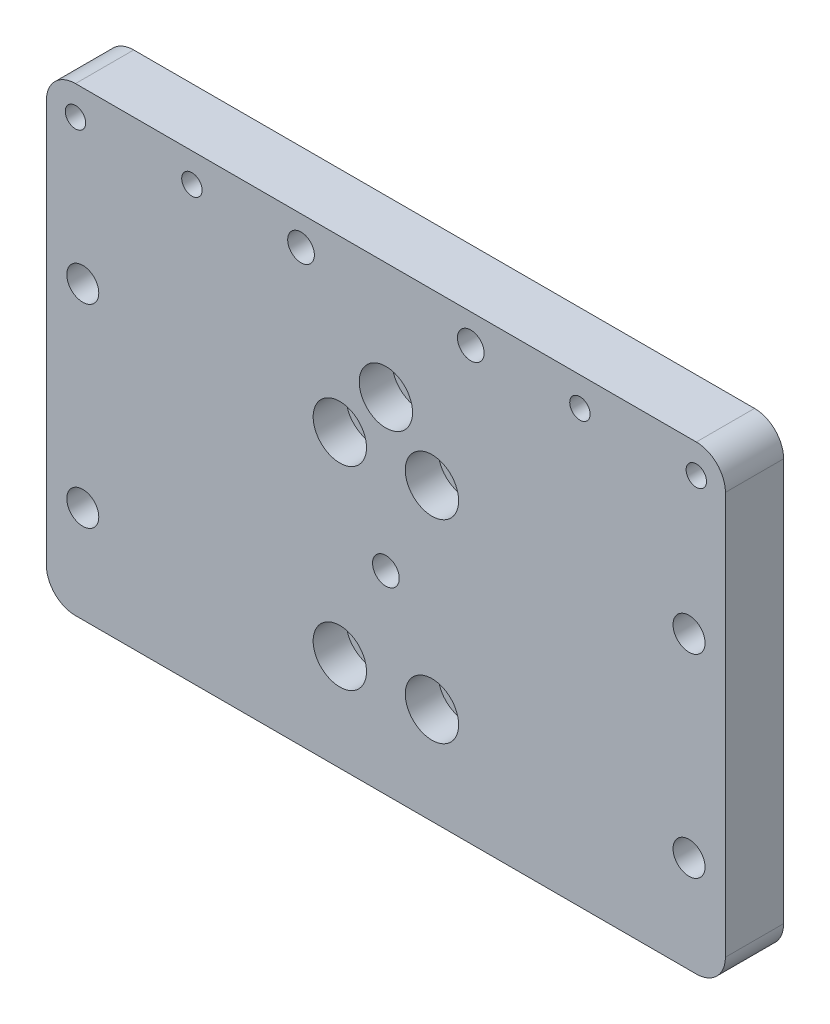
ISO-10303-21;
HEADER;
FILE_DESCRIPTION(('STEP AP214'),'2;1');
FILE_NAME('part.step','',(''),(''),'','','');
FILE_SCHEMA(('AUTOMOTIVE_DESIGN { 1 0 10303 214 1 1 1 1 }'));
ENDSEC;
DATA;
#1=APPLICATION_CONTEXT('core data for automotive mechanical design processes');
#2=APPLICATION_PROTOCOL_DEFINITION('international standard','automotive_design',2000,#1);
#3=PRODUCT_CONTEXT('',#1,'mechanical');
#4=PRODUCT('Part','Part','',(#3));
#5=PRODUCT_RELATED_PRODUCT_CATEGORY('part','',(#4));
#6=PRODUCT_DEFINITION_FORMATION('','',#4);
#7=PRODUCT_DEFINITION_CONTEXT('part definition',#1,'design');
#8=PRODUCT_DEFINITION('design','',#6,#7);
#9=PRODUCT_DEFINITION_SHAPE('','',#8);
#10=(LENGTH_UNIT() NAMED_UNIT(*) SI_UNIT(.MILLI.,.METRE.));
#11=(NAMED_UNIT(*) PLANE_ANGLE_UNIT() SI_UNIT($,.RADIAN.));
#12=(NAMED_UNIT(*) SI_UNIT($,.STERADIAN.) SOLID_ANGLE_UNIT());
#13=UNCERTAINTY_MEASURE_WITH_UNIT(LENGTH_MEASURE(1.E-05),#10,'distance_accuracy_value','');
#14=(GEOMETRIC_REPRESENTATION_CONTEXT(3) GLOBAL_UNCERTAINTY_ASSIGNED_CONTEXT((#13)) GLOBAL_UNIT_ASSIGNED_CONTEXT((#10,
#11,#12)) REPRESENTATION_CONTEXT('',''));
#15=CARTESIAN_POINT('',(0.,0.,0.));
#16=DIRECTION('',(0.,0.,1.));
#17=DIRECTION('',(1.,0.,0.));
#18=AXIS2_PLACEMENT_3D('',#15,#16,#17);
#19=CARTESIAN_POINT('',(0.,23.5,-6.));
#20=DIRECTION('',(0.,0.,1.));
#21=DIRECTION('',(1.,0.,0.));
#22=AXIS2_PLACEMENT_3D('',#19,#20,#21);
#23=CYLINDRICAL_SURFACE('',#22,2.75);
#24=CARTESIAN_POINT('',(0.,23.5,-6.));
#25=DIRECTION('',(0.,0.,1.));
#26=DIRECTION('',(1.,0.,0.));
#27=AXIS2_PLACEMENT_3D('',#24,#25,#26);
#28=CIRCLE('',#27,2.75);
#29=CARTESIAN_POINT('',(2.75000000000001,23.5,-6.));
#30=VERTEX_POINT('',#29);
#31=EDGE_CURVE('E181',#30,#30,#28,.T.);
#32=ORIENTED_EDGE('',*,*,#31,.F.);
#33=EDGE_LOOP('',(#32));
#34=FACE_BOUND('',#33,.T.);
#35=CARTESIAN_POINT('',(0.,23.5,-0.799999999999999));
#36=DIRECTION('',(0.,0.,1.));
#37=DIRECTION('',(1.,0.,0.));
#38=AXIS2_PLACEMENT_3D('',#35,#36,#37);
#39=CIRCLE('',#38,2.75);
#40=CARTESIAN_POINT('',(2.75000000000001,23.5,-0.799999999999999));
#41=VERTEX_POINT('',#40);
#42=EDGE_CURVE('E147',#41,#41,#39,.F.);
#43=ORIENTED_EDGE('',*,*,#42,.F.);
#44=EDGE_LOOP('',(#43));
#45=FACE_BOUND('',#44,.T.);
#46=ADVANCED_FACE('F32',(#34,#45),#23,.F.);
#47=CARTESIAN_POINT('',(-9.49999999999999,12.5,-6.));
#48=DIRECTION('',(0.,0.,1.));
#49=DIRECTION('',(1.,0.,0.));
#50=AXIS2_PLACEMENT_3D('',#47,#48,#49);
#51=CYLINDRICAL_SURFACE('',#50,3.3);
#52=CARTESIAN_POINT('',(-9.49999999999999,12.5,-6.));
#53=DIRECTION('',(0.,0.,1.));
#54=DIRECTION('',(1.,0.,0.));
#55=AXIS2_PLACEMENT_3D('',#52,#53,#54);
#56=CIRCLE('',#55,3.3);
#57=CARTESIAN_POINT('',(-6.19999999999999,12.5,-6.));
#58=VERTEX_POINT('',#57);
#59=EDGE_CURVE('E220',#58,#58,#56,.T.);
#60=ORIENTED_EDGE('',*,*,#59,.F.);
#61=EDGE_LOOP('',(#60));
#62=FACE_BOUND('',#61,.T.);
#63=CARTESIAN_POINT('',(-9.49999999999999,12.5,-0.799999999999999));
#64=DIRECTION('',(0.,0.,1.));
#65=DIRECTION('',(1.,0.,0.));
#66=AXIS2_PLACEMENT_3D('',#63,#64,#65);
#67=CIRCLE('',#66,3.3);
#68=CARTESIAN_POINT('',(-6.19999999999999,12.5,-0.799999999999999));
#69=VERTEX_POINT('',#68);
#70=EDGE_CURVE('E144',#69,#69,#67,.F.);
#71=ORIENTED_EDGE('',*,*,#70,.F.);
#72=EDGE_LOOP('',(#71));
#73=FACE_BOUND('',#72,.T.);
#74=ADVANCED_FACE('F352',(#62,#73),#51,.F.);
#75=CARTESIAN_POINT('',(9.50000000000001,12.5,-6.));
#76=DIRECTION('',(0.,0.,1.));
#77=DIRECTION('',(1.,0.,0.));
#78=AXIS2_PLACEMENT_3D('',#75,#76,#77);
#79=CYLINDRICAL_SURFACE('',#78,3.3);
#80=CARTESIAN_POINT('',(9.50000000000001,12.5,-6.));
#81=DIRECTION('',(0.,0.,1.));
#82=DIRECTION('',(-1.,0.,0.));
#83=AXIS2_PLACEMENT_3D('',#80,#81,#82);
#84=CIRCLE('',#83,3.3);
#85=CARTESIAN_POINT('',(6.20000000000001,12.5,-6.));
#86=VERTEX_POINT('',#85);
#87=EDGE_CURVE('E135',#86,#86,#84,.T.);
#88=ORIENTED_EDGE('',*,*,#87,.F.);
#89=EDGE_LOOP('',(#88));
#90=FACE_BOUND('',#89,.T.);
#91=CARTESIAN_POINT('',(9.50000000000001,12.5,-0.799999999999999));
#92=DIRECTION('',(0.,0.,1.));
#93=DIRECTION('',(1.,0.,0.));
#94=AXIS2_PLACEMENT_3D('',#91,#92,#93);
#95=CIRCLE('',#94,3.3);
#96=CARTESIAN_POINT('',(12.8,12.5,-0.799999999999999));
#97=VERTEX_POINT('',#96);
#98=EDGE_CURVE('E140',#97,#97,#95,.F.);
#99=ORIENTED_EDGE('',*,*,#98,.F.);
#100=EDGE_LOOP('',(#99));
#101=FACE_BOUND('',#100,.T.);
#102=ADVANCED_FACE('F358',(#90,#101),#79,.F.);
#103=CARTESIAN_POINT('',(9.50000000000001,-27.5,-6.));
#104=DIRECTION('',(0.,0.,1.));
#105=DIRECTION('',(1.,0.,0.));
#106=AXIS2_PLACEMENT_3D('',#103,#104,#105);
#107=CYLINDRICAL_SURFACE('',#106,3.3);
#108=CARTESIAN_POINT('',(9.50000000000001,-27.5,-6.));
#109=DIRECTION('',(0.,0.,1.));
#110=DIRECTION('',(-1.,0.,0.));
#111=AXIS2_PLACEMENT_3D('',#108,#109,#110);
#112=CIRCLE('',#111,3.3);
#113=CARTESIAN_POINT('',(6.20000000000001,-27.5,-6.));
#114=VERTEX_POINT('',#113);
#115=EDGE_CURVE('E254',#114,#114,#112,.T.);
#116=ORIENTED_EDGE('',*,*,#115,.F.);
#117=EDGE_LOOP('',(#116));
#118=FACE_BOUND('',#117,.T.);
#119=CARTESIAN_POINT('',(9.50000000000001,-27.5,-0.799999999999999));
#120=DIRECTION('',(0.,0.,1.));
#121=DIRECTION('',(1.,0.,0.));
#122=AXIS2_PLACEMENT_3D('',#119,#120,#121);
#123=CIRCLE('',#122,3.3);
#124=CARTESIAN_POINT('',(12.8,-27.5,-0.799999999999999));
#125=VERTEX_POINT('',#124);
#126=EDGE_CURVE('E137',#125,#125,#123,.F.);
#127=ORIENTED_EDGE('',*,*,#126,.F.);
#128=EDGE_LOOP('',(#127));
#129=FACE_BOUND('',#128,.T.);
#130=ADVANCED_FACE('F510',(#118,#129),#107,.F.);
#131=CARTESIAN_POINT('',(-9.49999999999999,-27.5,-6.));
#132=DIRECTION('',(0.,0.,1.));
#133=DIRECTION('',(1.,0.,0.));
#134=AXIS2_PLACEMENT_3D('',#131,#132,#133);
#135=CYLINDRICAL_SURFACE('',#134,3.3);
#136=CARTESIAN_POINT('',(-9.49999999999999,-27.5,-6.));
#137=DIRECTION('',(0.,0.,1.));
#138=DIRECTION('',(1.,0.,0.));
#139=AXIS2_PLACEMENT_3D('',#136,#137,#138);
#140=CIRCLE('',#139,3.3);
#141=CARTESIAN_POINT('',(-6.19999999999999,-27.5,-6.));
#142=VERTEX_POINT('',#141);
#143=EDGE_CURVE('E217',#142,#142,#140,.T.);
#144=ORIENTED_EDGE('',*,*,#143,.F.);
#145=EDGE_LOOP('',(#144));
#146=FACE_BOUND('',#145,.T.);
#147=CARTESIAN_POINT('',(-9.49999999999999,-27.5,-0.799999999999999));
#148=DIRECTION('',(0.,0.,1.));
#149=DIRECTION('',(1.,0.,0.));
#150=AXIS2_PLACEMENT_3D('',#147,#148,#149);
#151=CIRCLE('',#150,3.3);
#152=CARTESIAN_POINT('',(-6.19999999999999,-27.5,-0.799999999999999));
#153=VERTEX_POINT('',#152);
#154=EDGE_CURVE('E132',#153,#153,#151,.F.);
#155=ORIENTED_EDGE('',*,*,#154,.F.);
#156=EDGE_LOOP('',(#155));
#157=FACE_BOUND('',#156,.T.);
#158=ADVANCED_FACE('F379',(#146,#157),#135,.F.);
#159=CARTESIAN_POINT('',(-70.,-47.5,6.));
#160=DIRECTION('',(1.,0.,0.));
#161=DIRECTION('',(0.,0.,-1.));
#162=AXIS2_PLACEMENT_3D('',#159,#160,#161);
#163=PLANE('',#162);
#164=DIRECTION('',(0.,-1.,0.));
#165=VECTOR('',#164,1.);
#166=CARTESIAN_POINT('',(-70.,-47.5,-6.));
#167=LINE('',#166,#165);
#168=CARTESIAN_POINT('',(-70.,41.5,-6.));
#169=VERTEX_POINT('',#168);
#170=CARTESIAN_POINT('',(-70.,-41.5,-6.));
#171=VERTEX_POINT('',#170);
#172=EDGE_CURVE('E128',#169,#171,#167,.T.);
#173=ORIENTED_EDGE('',*,*,#172,.T.);
#174=DIRECTION('',(0.,0.,-1.));
#175=VECTOR('',#174,1.);
#176=CARTESIAN_POINT('',(-70.,-41.5,6.));
#177=LINE('',#176,#175);
#178=CARTESIAN_POINT('',(-70.,-41.5,6.));
#179=VERTEX_POINT('',#178);
#180=EDGE_CURVE('E11',#171,#179,#177,.F.);
#181=ORIENTED_EDGE('',*,*,#180,.T.);
#182=DIRECTION('',(0.,-1.,0.));
#183=VECTOR('',#182,1.);
#184=CARTESIAN_POINT('',(-70.,-47.5,6.));
#185=LINE('',#184,#183);
#186=CARTESIAN_POINT('',(-70.,41.5,6.));
#187=VERTEX_POINT('',#186);
#188=EDGE_CURVE('E126',#187,#179,#185,.T.);
#189=ORIENTED_EDGE('',*,*,#188,.F.);
#190=DIRECTION('',(0.,0.,-1.));
#191=VECTOR('',#190,1.);
#192=CARTESIAN_POINT('',(-70.,41.5,6.));
#193=LINE('',#192,#191);
#194=EDGE_CURVE('E40',#187,#169,#193,.T.);
#195=ORIENTED_EDGE('',*,*,#194,.T.);
#196=EDGE_LOOP('',(#173,#181,#189,#195));
#197=FACE_BOUND('',#196,.T.);
#198=ADVANCED_FACE('F176',(#197),#163,.F.);
#199=CARTESIAN_POINT('',(70.,-47.5,6.));
#200=DIRECTION('',(0.,1.,0.));
#201=DIRECTION('',(-1.,0.,0.));
#202=AXIS2_PLACEMENT_3D('',#199,#200,#201);
#203=PLANE('',#202);
#204=DIRECTION('',(1.,0.,0.));
#205=VECTOR('',#204,1.);
#206=CARTESIAN_POINT('',(70.,-47.5,-6.));
#207=LINE('',#206,#205);
#208=CARTESIAN_POINT('',(-64.,-47.5,-6.));
#209=VERTEX_POINT('',#208);
#210=CARTESIAN_POINT('',(64.,-47.5,-6.));
#211=VERTEX_POINT('',#210);
#212=EDGE_CURVE('E124',#209,#211,#207,.T.);
#213=ORIENTED_EDGE('',*,*,#212,.T.);
#214=DIRECTION('',(0.,0.,-1.));
#215=VECTOR('',#214,1.);
#216=CARTESIAN_POINT('',(64.,-47.5,6.));
#217=LINE('',#216,#215);
#218=CARTESIAN_POINT('',(64.,-47.5,6.));
#219=VERTEX_POINT('',#218);
#220=EDGE_CURVE('E103',#211,#219,#217,.F.);
#221=ORIENTED_EDGE('',*,*,#220,.T.);
#222=DIRECTION('',(1.,0.,0.));
#223=VECTOR('',#222,1.);
#224=CARTESIAN_POINT('',(70.,-47.5,6.));
#225=LINE('',#224,#223);
#226=CARTESIAN_POINT('',(-64.,-47.5,6.));
#227=VERTEX_POINT('',#226);
#228=EDGE_CURVE('E188',#227,#219,#225,.T.);
#229=ORIENTED_EDGE('',*,*,#228,.F.);
#230=DIRECTION('',(0.,0.,-1.));
#231=VECTOR('',#230,1.);
#232=CARTESIAN_POINT('',(-64.,-47.5,6.));
#233=LINE('',#232,#231);
#234=EDGE_CURVE('E108',#227,#209,#233,.T.);
#235=ORIENTED_EDGE('',*,*,#234,.T.);
#236=EDGE_LOOP('',(#213,#221,#229,#235));
#237=FACE_BOUND('',#236,.T.);
#238=ADVANCED_FACE('F343',(#237),#203,.F.);
#239=CARTESIAN_POINT('',(70.,-47.5,6.));
#240=DIRECTION('',(-1.,0.,0.));
#241=DIRECTION('',(0.,0.,1.));
#242=AXIS2_PLACEMENT_3D('',#239,#240,#241);
#243=PLANE('',#242);
#244=DIRECTION('',(0.,1.,0.));
#245=VECTOR('',#244,1.);
#246=CARTESIAN_POINT('',(70.,-47.5,6.));
#247=LINE('',#246,#245);
#248=CARTESIAN_POINT('',(70.,-41.5,6.));
#249=VERTEX_POINT('',#248);
#250=CARTESIAN_POINT('',(70.,41.5,6.));
#251=VERTEX_POINT('',#250);
#252=EDGE_CURVE('E117',#249,#251,#247,.T.);
#253=ORIENTED_EDGE('',*,*,#252,.F.);
#254=DIRECTION('',(0.,0.,-1.));
#255=VECTOR('',#254,1.);
#256=CARTESIAN_POINT('',(70.,-41.5,6.));
#257=LINE('',#256,#255);
#258=CARTESIAN_POINT('',(70.,-41.5,-6.));
#259=VERTEX_POINT('',#258);
#260=EDGE_CURVE('E102',#249,#259,#257,.T.);
#261=ORIENTED_EDGE('',*,*,#260,.T.);
#262=DIRECTION('',(0.,1.,0.));
#263=VECTOR('',#262,1.);
#264=CARTESIAN_POINT('',(70.,-47.5,-6.));
#265=LINE('',#264,#263);
#266=CARTESIAN_POINT('',(70.,41.5,-6.));
#267=VERTEX_POINT('',#266);
#268=EDGE_CURVE('E115',#259,#267,#265,.T.);
#269=ORIENTED_EDGE('',*,*,#268,.T.);
#270=DIRECTION('',(0.,0.,-1.));
#271=VECTOR('',#270,1.);
#272=CARTESIAN_POINT('',(70.,41.5,6.));
#273=LINE('',#272,#271);
#274=EDGE_CURVE('E119',#267,#251,#273,.F.);
#275=ORIENTED_EDGE('',*,*,#274,.T.);
#276=EDGE_LOOP('',(#253,#261,#269,#275));
#277=FACE_BOUND('',#276,.T.);
#278=ADVANCED_FACE('F114',(#277),#243,.F.);
#279=CARTESIAN_POINT('',(70.,47.5,6.));
#280=DIRECTION('',(0.,-1.,0.));
#281=DIRECTION('',(1.,0.,0.));
#282=AXIS2_PLACEMENT_3D('',#279,#280,#281);
#283=PLANE('',#282);
#284=DIRECTION('',(-1.,0.,0.));
#285=VECTOR('',#284,1.);
#286=CARTESIAN_POINT('',(70.,47.5,6.));
#287=LINE('',#286,#285);
#288=CARTESIAN_POINT('',(64.,47.5,6.));
#289=VERTEX_POINT('',#288);
#290=CARTESIAN_POINT('',(-64.,47.5,6.));
#291=VERTEX_POINT('',#290);
#292=EDGE_CURVE('E151',#289,#291,#287,.T.);
#293=ORIENTED_EDGE('',*,*,#292,.F.);
#294=DIRECTION('',(0.,0.,-1.));
#295=VECTOR('',#294,1.);
#296=CARTESIAN_POINT('',(64.,47.5,6.));
#297=LINE('',#296,#295);
#298=CARTESIAN_POINT('',(64.,47.5,-6.));
#299=VERTEX_POINT('',#298);
#300=EDGE_CURVE('E168',#289,#299,#297,.T.);
#301=ORIENTED_EDGE('',*,*,#300,.T.);
#302=DIRECTION('',(-1.,0.,0.));
#303=VECTOR('',#302,1.);
#304=CARTESIAN_POINT('',(70.,47.5,-6.));
#305=LINE('',#304,#303);
#306=CARTESIAN_POINT('',(-64.,47.5,-6.));
#307=VERTEX_POINT('',#306);
#308=EDGE_CURVE('E123',#299,#307,#305,.T.);
#309=ORIENTED_EDGE('',*,*,#308,.T.);
#310=DIRECTION('',(0.,0.,-1.));
#311=VECTOR('',#310,1.);
#312=CARTESIAN_POINT('',(-64.,47.5,6.));
#313=LINE('',#312,#311);
#314=EDGE_CURVE('E47',#307,#291,#313,.F.);
#315=ORIENTED_EDGE('',*,*,#314,.T.);
#316=EDGE_LOOP('',(#293,#301,#309,#315));
#317=FACE_BOUND('',#316,.T.);
#318=ADVANCED_FACE('F309',(#317),#283,.F.);
#319=CARTESIAN_POINT('',(0.,0.,6.));
#320=DIRECTION('',(0.,0.,1.));
#321=DIRECTION('',(1.,0.,0.));
#322=AXIS2_PLACEMENT_3D('',#319,#320,#321);
#323=PLANE('',#322);
#324=CARTESIAN_POINT('',(0.,23.5,6.));
#325=DIRECTION('',(0.,0.,1.));
#326=DIRECTION('',(1.,0.,0.));
#327=AXIS2_PLACEMENT_3D('',#324,#325,#326);
#328=CIRCLE('',#327,5.5);
#329=CARTESIAN_POINT('',(5.50000000000001,23.5,6.));
#330=VERTEX_POINT('',#329);
#331=EDGE_CURVE('E284',#330,#330,#328,.T.);
#332=ORIENTED_EDGE('',*,*,#331,.F.);
#333=EDGE_LOOP('',(#332));
#334=FACE_BOUND('',#333,.T.);
#335=CARTESIAN_POINT('',(-9.49999999999999,12.5,6.));
#336=DIRECTION('',(0.,0.,1.));
#337=DIRECTION('',(1.,0.,0.));
#338=AXIS2_PLACEMENT_3D('',#335,#336,#337);
#339=CIRCLE('',#338,5.5);
#340=CARTESIAN_POINT('',(-3.99999999999999,12.5,6.));
#341=VERTEX_POINT('',#340);
#342=EDGE_CURVE('E290',#341,#341,#339,.T.);
#343=ORIENTED_EDGE('',*,*,#342,.F.);
#344=EDGE_LOOP('',(#343));
#345=FACE_BOUND('',#344,.T.);
#346=CARTESIAN_POINT('',(9.50000000000001,12.5,6.));
#347=DIRECTION('',(0.,0.,1.));
#348=DIRECTION('',(1.,0.,0.));
#349=AXIS2_PLACEMENT_3D('',#346,#347,#348);
#350=CIRCLE('',#349,5.5);
#351=CARTESIAN_POINT('',(15.,12.5,6.));
#352=VERTEX_POINT('',#351);
#353=EDGE_CURVE('E272',#352,#352,#350,.T.);
#354=ORIENTED_EDGE('',*,*,#353,.F.);
#355=EDGE_LOOP('',(#354));
#356=FACE_BOUND('',#355,.T.);
#357=CARTESIAN_POINT('',(9.50000000000001,-27.5,6.));
#358=DIRECTION('',(0.,0.,1.));
#359=DIRECTION('',(1.,0.,0.));
#360=AXIS2_PLACEMENT_3D('',#357,#358,#359);
#361=CIRCLE('',#360,5.5);
#362=CARTESIAN_POINT('',(15.,-27.5,6.));
#363=VERTEX_POINT('',#362);
#364=EDGE_CURVE('E279',#363,#363,#361,.T.);
#365=ORIENTED_EDGE('',*,*,#364,.F.);
#366=EDGE_LOOP('',(#365));
#367=FACE_BOUND('',#366,.T.);
#368=CARTESIAN_POINT('',(-9.49999999999999,-27.5,6.));
#369=DIRECTION('',(0.,0.,1.));
#370=DIRECTION('',(1.,0.,0.));
#371=AXIS2_PLACEMENT_3D('',#368,#369,#370);
#372=CIRCLE('',#371,5.5);
#373=CARTESIAN_POINT('',(-3.99999999999999,-27.5,6.));
#374=VERTEX_POINT('',#373);
#375=EDGE_CURVE('E150',#374,#374,#372,.T.);
#376=ORIENTED_EDGE('',*,*,#375,.F.);
#377=EDGE_LOOP('',(#376));
#378=FACE_BOUND('',#377,.T.);
#379=CARTESIAN_POINT('',(-62.5,-27.5,6.));
#380=DIRECTION('',(0.,0.,1.));
#381=DIRECTION('',(1.,0.,0.));
#382=AXIS2_PLACEMENT_3D('',#379,#380,#381);
#383=CIRCLE('',#382,3.3);
#384=CARTESIAN_POINT('',(-59.2,-27.5,6.));
#385=VERTEX_POINT('',#384);
#386=EDGE_CURVE('E247',#385,#385,#383,.T.);
#387=ORIENTED_EDGE('',*,*,#386,.F.);
#388=EDGE_LOOP('',(#387));
#389=FACE_BOUND('',#388,.T.);
#390=CARTESIAN_POINT('',(62.5000000000001,-27.5,6.));
#391=DIRECTION('',(0.,0.,1.));
#392=DIRECTION('',(-1.,0.,0.));
#393=AXIS2_PLACEMENT_3D('',#390,#391,#392);
#394=CIRCLE('',#393,3.3);
#395=CARTESIAN_POINT('',(59.2000000000001,-27.5,6.));
#396=VERTEX_POINT('',#395);
#397=EDGE_CURVE('E241',#396,#396,#394,.T.);
#398=ORIENTED_EDGE('',*,*,#397,.F.);
#399=EDGE_LOOP('',(#398));
#400=FACE_BOUND('',#399,.T.);
#401=CARTESIAN_POINT('',(62.5,12.5,6.));
#402=DIRECTION('',(0.,0.,1.));
#403=DIRECTION('',(-1.,0.,0.));
#404=AXIS2_PLACEMENT_3D('',#401,#402,#403);
#405=CIRCLE('',#404,3.3);
#406=CARTESIAN_POINT('',(59.2,12.5,6.));
#407=VERTEX_POINT('',#406);
#408=EDGE_CURVE('E235',#407,#407,#405,.T.);
#409=ORIENTED_EDGE('',*,*,#408,.F.);
#410=EDGE_LOOP('',(#409));
#411=FACE_BOUND('',#410,.T.);
#412=CARTESIAN_POINT('',(64.,41.5,6.));
#413=DIRECTION('',(0.,0.,1.));
#414=DIRECTION('',(-1.,0.,0.));
#415=AXIS2_PLACEMENT_3D('',#412,#413,#414);
#416=CIRCLE('',#415,2.1);
#417=CARTESIAN_POINT('',(61.9,41.5,6.));
#418=VERTEX_POINT('',#417);
#419=EDGE_CURVE('E228',#418,#418,#416,.T.);
#420=ORIENTED_EDGE('',*,*,#419,.F.);
#421=EDGE_LOOP('',(#420));
#422=FACE_BOUND('',#421,.T.);
#423=CARTESIAN_POINT('',(40.,41.5,6.));
#424=DIRECTION('',(0.,0.,1.));
#425=DIRECTION('',(-1.,0.,0.));
#426=AXIS2_PLACEMENT_3D('',#423,#424,#425);
#427=CIRCLE('',#426,2.1);
#428=CARTESIAN_POINT('',(37.9,41.5,6.));
#429=VERTEX_POINT('',#428);
#430=EDGE_CURVE('E263',#429,#429,#427,.T.);
#431=ORIENTED_EDGE('',*,*,#430,.F.);
#432=EDGE_LOOP('',(#431));
#433=FACE_BOUND('',#432,.T.);
#434=CARTESIAN_POINT('',(17.5,41.5,6.));
#435=DIRECTION('',(0.,0.,1.));
#436=DIRECTION('',(-1.,0.,0.));
#437=AXIS2_PLACEMENT_3D('',#434,#435,#436);
#438=CIRCLE('',#437,2.75);
#439=CARTESIAN_POINT('',(14.75,41.5,6.));
#440=VERTEX_POINT('',#439);
#441=EDGE_CURVE('E257',#440,#440,#438,.T.);
#442=ORIENTED_EDGE('',*,*,#441,.F.);
#443=EDGE_LOOP('',(#442));
#444=FACE_BOUND('',#443,.T.);
#445=CARTESIAN_POINT('',(-62.5,12.5,6.));
#446=DIRECTION('',(0.,0.,1.));
#447=DIRECTION('',(1.,0.,0.));
#448=AXIS2_PLACEMENT_3D('',#445,#446,#447);
#449=CIRCLE('',#448,3.3);
#450=CARTESIAN_POINT('',(-59.2,12.5,6.));
#451=VERTEX_POINT('',#450);
#452=EDGE_CURVE('E192',#451,#451,#449,.T.);
#453=ORIENTED_EDGE('',*,*,#452,.F.);
#454=EDGE_LOOP('',(#453));
#455=FACE_BOUND('',#454,.T.);
#456=CARTESIAN_POINT('',(-64.,41.5,6.));
#457=DIRECTION('',(0.,0.,1.));
#458=DIRECTION('',(1.,0.,0.));
#459=AXIS2_PLACEMENT_3D('',#456,#457,#458);
#460=CIRCLE('',#459,2.1);
#461=CARTESIAN_POINT('',(-61.9,41.5,6.));
#462=VERTEX_POINT('',#461);
#463=EDGE_CURVE('E199',#462,#462,#460,.T.);
#464=ORIENTED_EDGE('',*,*,#463,.F.);
#465=EDGE_LOOP('',(#464));
#466=FACE_BOUND('',#465,.T.);
#467=CARTESIAN_POINT('',(-40.,41.5,6.));
#468=DIRECTION('',(0.,0.,1.));
#469=DIRECTION('',(1.,0.,0.));
#470=AXIS2_PLACEMENT_3D('',#467,#468,#469);
#471=CIRCLE('',#470,2.1);
#472=CARTESIAN_POINT('',(-37.9,41.5,6.));
#473=VERTEX_POINT('',#472);
#474=EDGE_CURVE('E205',#473,#473,#471,.T.);
#475=ORIENTED_EDGE('',*,*,#474,.F.);
#476=EDGE_LOOP('',(#475));
#477=FACE_BOUND('',#476,.T.);
#478=CARTESIAN_POINT('',(-17.5,41.5,6.));
#479=DIRECTION('',(0.,0.,1.));
#480=DIRECTION('',(1.,0.,0.));
#481=AXIS2_PLACEMENT_3D('',#478,#479,#480);
#482=CIRCLE('',#481,2.75);
#483=CARTESIAN_POINT('',(-14.75,41.5,6.));
#484=VERTEX_POINT('',#483);
#485=EDGE_CURVE('E211',#484,#484,#482,.T.);
#486=ORIENTED_EDGE('',*,*,#485,.F.);
#487=EDGE_LOOP('',(#486));
#488=FACE_BOUND('',#487,.T.);
#489=CARTESIAN_POINT('',(0.,-7.49999999999999,6.));
#490=DIRECTION('',(0.,0.,1.));
#491=DIRECTION('',(1.,0.,0.));
#492=AXIS2_PLACEMENT_3D('',#489,#490,#491);
#493=CIRCLE('',#492,2.75);
#494=CARTESIAN_POINT('',(2.75000000000001,-7.49999999999999,6.));
#495=VERTEX_POINT('',#494);
#496=EDGE_CURVE('E223',#495,#495,#493,.T.);
#497=ORIENTED_EDGE('',*,*,#496,.F.);
#498=EDGE_LOOP('',(#497));
#499=FACE_BOUND('',#498,.T.);
#500=ORIENTED_EDGE('',*,*,#228,.T.);
#501=CARTESIAN_POINT('',(64.,-41.5,6.));
#502=DIRECTION('',(0.,0.,1.));
#503=DIRECTION('',(1.,0.,0.));
#504=AXIS2_PLACEMENT_3D('',#501,#502,#503);
#505=CIRCLE('',#504,6.);
#506=EDGE_CURVE('E165',#219,#249,#505,.T.);
#507=ORIENTED_EDGE('',*,*,#506,.T.);
#508=ORIENTED_EDGE('',*,*,#252,.T.);
#509=CARTESIAN_POINT('',(64.,41.5,6.));
#510=DIRECTION('',(0.,0.,1.));
#511=DIRECTION('',(1.,0.,0.));
#512=AXIS2_PLACEMENT_3D('',#509,#510,#511);
#513=CIRCLE('',#512,6.);
#514=EDGE_CURVE('E54',#251,#289,#513,.T.);
#515=ORIENTED_EDGE('',*,*,#514,.T.);
#516=ORIENTED_EDGE('',*,*,#292,.T.);
#517=CARTESIAN_POINT('',(-64.,41.5,6.));
#518=DIRECTION('',(0.,0.,1.));
#519=DIRECTION('',(1.,0.,0.));
#520=AXIS2_PLACEMENT_3D('',#517,#518,#519);
#521=CIRCLE('',#520,6.);
#522=EDGE_CURVE('E160',#291,#187,#521,.T.);
#523=ORIENTED_EDGE('',*,*,#522,.T.);
#524=ORIENTED_EDGE('',*,*,#188,.T.);
#525=CARTESIAN_POINT('',(-64.,-41.5,6.));
#526=DIRECTION('',(0.,0.,1.));
#527=DIRECTION('',(1.,0.,0.));
#528=AXIS2_PLACEMENT_3D('',#525,#526,#527);
#529=CIRCLE('',#528,6.);
#530=EDGE_CURVE('E162',#179,#227,#529,.T.);
#531=ORIENTED_EDGE('',*,*,#530,.T.);
#532=EDGE_LOOP('',(#500,#507,#508,#515,#516,#523,#524,#531));
#533=FACE_BOUND('',#532,.T.);
#534=ADVANCED_FACE('F306',(#334,#345,#356,#367,#378,#389,#400,#411,#422,#433,#444,#455,#466,
#477,#488,#499,#533),#323,.T.);
#535=CARTESIAN_POINT('',(0.,0.,-6.));
#536=DIRECTION('',(0.,0.,1.));
#537=DIRECTION('',(1.,0.,0.));
#538=AXIS2_PLACEMENT_3D('',#535,#536,#537);
#539=PLANE('',#538);
#540=CARTESIAN_POINT('',(-62.5,-27.5,-6.));
#541=DIRECTION('',(0.,0.,1.));
#542=DIRECTION('',(1.,0.,0.));
#543=AXIS2_PLACEMENT_3D('',#540,#541,#542);
#544=CIRCLE('',#543,3.3);
#545=CARTESIAN_POINT('',(-59.2,-27.5,-6.));
#546=VERTEX_POINT('',#545);
#547=EDGE_CURVE('E196',#546,#546,#544,.T.);
#548=ORIENTED_EDGE('',*,*,#547,.T.);
#549=EDGE_LOOP('',(#548));
#550=FACE_BOUND('',#549,.T.);
#551=CARTESIAN_POINT('',(62.5000000000001,-27.5,-6.));
#552=DIRECTION('',(0.,0.,1.));
#553=DIRECTION('',(-1.,0.,0.));
#554=AXIS2_PLACEMENT_3D('',#551,#552,#553);
#555=CIRCLE('',#554,3.3);
#556=CARTESIAN_POINT('',(59.2000000000001,-27.5,-6.));
#557=VERTEX_POINT('',#556);
#558=EDGE_CURVE('E244',#557,#557,#555,.T.);
#559=ORIENTED_EDGE('',*,*,#558,.T.);
#560=EDGE_LOOP('',(#559));
#561=FACE_BOUND('',#560,.T.);
#562=CARTESIAN_POINT('',(62.5,12.5,-6.));
#563=DIRECTION('',(0.,0.,1.));
#564=DIRECTION('',(-1.,0.,0.));
#565=AXIS2_PLACEMENT_3D('',#562,#563,#564);
#566=CIRCLE('',#565,3.3);
#567=CARTESIAN_POINT('',(59.2,12.5,-6.));
#568=VERTEX_POINT('',#567);
#569=EDGE_CURVE('E238',#568,#568,#566,.T.);
#570=ORIENTED_EDGE('',*,*,#569,.T.);
#571=EDGE_LOOP('',(#570));
#572=FACE_BOUND('',#571,.T.);
#573=CARTESIAN_POINT('',(64.,41.5,-6.));
#574=DIRECTION('',(0.,0.,1.));
#575=DIRECTION('',(-1.,0.,0.));
#576=AXIS2_PLACEMENT_3D('',#573,#574,#575);
#577=CIRCLE('',#576,2.1);
#578=CARTESIAN_POINT('',(61.9,41.5,-6.));
#579=VERTEX_POINT('',#578);
#580=EDGE_CURVE('E231',#579,#579,#577,.T.);
#581=ORIENTED_EDGE('',*,*,#580,.T.);
#582=EDGE_LOOP('',(#581));
#583=FACE_BOUND('',#582,.T.);
#584=CARTESIAN_POINT('',(40.,41.5,-6.));
#585=DIRECTION('',(0.,0.,1.));
#586=DIRECTION('',(-1.,0.,0.));
#587=AXIS2_PLACEMENT_3D('',#584,#585,#586);
#588=CIRCLE('',#587,2.1);
#589=CARTESIAN_POINT('',(37.9,41.5,-6.));
#590=VERTEX_POINT('',#589);
#591=EDGE_CURVE('E232',#590,#590,#588,.T.);
#592=ORIENTED_EDGE('',*,*,#591,.T.);
#593=EDGE_LOOP('',(#592));
#594=FACE_BOUND('',#593,.T.);
#595=CARTESIAN_POINT('',(17.5,41.5,-6.));
#596=DIRECTION('',(0.,0.,1.));
#597=DIRECTION('',(-1.,0.,0.));
#598=AXIS2_PLACEMENT_3D('',#595,#596,#597);
#599=CIRCLE('',#598,2.75);
#600=CARTESIAN_POINT('',(14.75,41.5,-6.));
#601=VERTEX_POINT('',#600);
#602=EDGE_CURVE('E260',#601,#601,#599,.T.);
#603=ORIENTED_EDGE('',*,*,#602,.T.);
#604=EDGE_LOOP('',(#603));
#605=FACE_BOUND('',#604,.T.);
#606=ORIENTED_EDGE('',*,*,#115,.T.);
#607=EDGE_LOOP('',(#606));
#608=FACE_BOUND('',#607,.T.);
#609=ORIENTED_EDGE('',*,*,#87,.T.);
#610=EDGE_LOOP('',(#609));
#611=FACE_BOUND('',#610,.T.);
#612=CARTESIAN_POINT('',(-62.5,12.5,-6.));
#613=DIRECTION('',(0.,0.,1.));
#614=DIRECTION('',(1.,0.,0.));
#615=AXIS2_PLACEMENT_3D('',#612,#613,#614);
#616=CIRCLE('',#615,3.3);
#617=CARTESIAN_POINT('',(-59.2,12.5,-6.));
#618=VERTEX_POINT('',#617);
#619=EDGE_CURVE('E195',#618,#618,#616,.T.);
#620=ORIENTED_EDGE('',*,*,#619,.T.);
#621=EDGE_LOOP('',(#620));
#622=FACE_BOUND('',#621,.T.);
#623=CARTESIAN_POINT('',(-64.,41.5,-6.));
#624=DIRECTION('',(0.,0.,1.));
#625=DIRECTION('',(1.,0.,0.));
#626=AXIS2_PLACEMENT_3D('',#623,#624,#625);
#627=CIRCLE('',#626,2.1);
#628=CARTESIAN_POINT('',(-61.9,41.5,-6.));
#629=VERTEX_POINT('',#628);
#630=EDGE_CURVE('E202',#629,#629,#627,.T.);
#631=ORIENTED_EDGE('',*,*,#630,.T.);
#632=EDGE_LOOP('',(#631));
#633=FACE_BOUND('',#632,.T.);
#634=CARTESIAN_POINT('',(-40.,41.5,-6.));
#635=DIRECTION('',(0.,0.,1.));
#636=DIRECTION('',(1.,0.,0.));
#637=AXIS2_PLACEMENT_3D('',#634,#635,#636);
#638=CIRCLE('',#637,2.1);
#639=CARTESIAN_POINT('',(-37.9,41.5,-6.));
#640=VERTEX_POINT('',#639);
#641=EDGE_CURVE('E208',#640,#640,#638,.T.);
#642=ORIENTED_EDGE('',*,*,#641,.T.);
#643=EDGE_LOOP('',(#642));
#644=FACE_BOUND('',#643,.T.);
#645=CARTESIAN_POINT('',(-17.5,41.5,-6.));
#646=DIRECTION('',(0.,0.,1.));
#647=DIRECTION('',(1.,0.,0.));
#648=AXIS2_PLACEMENT_3D('',#645,#646,#647);
#649=CIRCLE('',#648,2.75);
#650=CARTESIAN_POINT('',(-14.75,41.5,-6.));
#651=VERTEX_POINT('',#650);
#652=EDGE_CURVE('E214',#651,#651,#649,.T.);
#653=ORIENTED_EDGE('',*,*,#652,.T.);
#654=EDGE_LOOP('',(#653));
#655=FACE_BOUND('',#654,.T.);
#656=ORIENTED_EDGE('',*,*,#143,.T.);
#657=EDGE_LOOP('',(#656));
#658=FACE_BOUND('',#657,.T.);
#659=ORIENTED_EDGE('',*,*,#59,.T.);
#660=EDGE_LOOP('',(#659));
#661=FACE_BOUND('',#660,.T.);
#662=CARTESIAN_POINT('',(0.,-7.49999999999999,-6.));
#663=DIRECTION('',(0.,0.,1.));
#664=DIRECTION('',(1.,0.,0.));
#665=AXIS2_PLACEMENT_3D('',#662,#663,#664);
#666=CIRCLE('',#665,2.75);
#667=CARTESIAN_POINT('',(2.75000000000001,-7.49999999999999,-6.));
#668=VERTEX_POINT('',#667);
#669=EDGE_CURVE('E183',#668,#668,#666,.T.);
#670=ORIENTED_EDGE('',*,*,#669,.T.);
#671=EDGE_LOOP('',(#670));
#672=FACE_BOUND('',#671,.T.);
#673=ORIENTED_EDGE('',*,*,#31,.T.);
#674=EDGE_LOOP('',(#673));
#675=FACE_BOUND('',#674,.T.);
#676=ORIENTED_EDGE('',*,*,#268,.F.);
#677=CARTESIAN_POINT('',(64.,-41.5,-6.));
#678=DIRECTION('',(0.,0.,1.));
#679=DIRECTION('',(1.,0.,0.));
#680=AXIS2_PLACEMENT_3D('',#677,#678,#679);
#681=CIRCLE('',#680,6.);
#682=EDGE_CURVE('E98',#259,#211,#681,.F.);
#683=ORIENTED_EDGE('',*,*,#682,.T.);
#684=ORIENTED_EDGE('',*,*,#212,.F.);
#685=CARTESIAN_POINT('',(-64.,-41.5,-6.));
#686=DIRECTION('',(0.,0.,1.));
#687=DIRECTION('',(1.,0.,0.));
#688=AXIS2_PLACEMENT_3D('',#685,#686,#687);
#689=CIRCLE('',#688,6.);
#690=EDGE_CURVE('E154',#209,#171,#689,.F.);
#691=ORIENTED_EDGE('',*,*,#690,.T.);
#692=ORIENTED_EDGE('',*,*,#172,.F.);
#693=CARTESIAN_POINT('',(-64.,41.5,-6.));
#694=DIRECTION('',(0.,0.,1.));
#695=DIRECTION('',(1.,0.,0.));
#696=AXIS2_PLACEMENT_3D('',#693,#694,#695);
#697=CIRCLE('',#696,6.);
#698=EDGE_CURVE('E118',#169,#307,#697,.F.);
#699=ORIENTED_EDGE('',*,*,#698,.T.);
#700=ORIENTED_EDGE('',*,*,#308,.F.);
#701=CARTESIAN_POINT('',(64.,41.5,-6.));
#702=DIRECTION('',(0.,0.,1.));
#703=DIRECTION('',(1.,0.,0.));
#704=AXIS2_PLACEMENT_3D('',#701,#702,#703);
#705=CIRCLE('',#704,6.);
#706=EDGE_CURVE('E109',#299,#267,#705,.F.);
#707=ORIENTED_EDGE('',*,*,#706,.T.);
#708=EDGE_LOOP('',(#676,#683,#684,#691,#692,#699,#700,#707));
#709=FACE_BOUND('',#708,.T.);
#710=ADVANCED_FACE('F121',(#550,#561,#572,#583,#594,#605,#608,#611,#622,#633,#644,#655,#658,
#661,#672,#675,#709),#539,.F.);
#711=CARTESIAN_POINT('',(0.,-7.49999999999999,-6.));
#712=DIRECTION('',(0.,0.,1.));
#713=DIRECTION('',(1.,0.,0.));
#714=AXIS2_PLACEMENT_3D('',#711,#712,#713);
#715=CYLINDRICAL_SURFACE('',#714,2.75);
#716=ORIENTED_EDGE('',*,*,#669,.F.);
#717=EDGE_LOOP('',(#716));
#718=FACE_BOUND('',#717,.T.);
#719=ORIENTED_EDGE('',*,*,#496,.T.);
#720=EDGE_LOOP('',(#719));
#721=FACE_BOUND('',#720,.T.);
#722=ADVANCED_FACE('F369',(#718,#721),#715,.F.);
#723=CARTESIAN_POINT('',(-17.5,41.5,-6.));
#724=DIRECTION('',(0.,0.,1.));
#725=DIRECTION('',(1.,0.,0.));
#726=AXIS2_PLACEMENT_3D('',#723,#724,#725);
#727=CYLINDRICAL_SURFACE('',#726,2.75);
#728=ORIENTED_EDGE('',*,*,#652,.F.);
#729=EDGE_LOOP('',(#728));
#730=FACE_BOUND('',#729,.T.);
#731=ORIENTED_EDGE('',*,*,#485,.T.);
#732=EDGE_LOOP('',(#731));
#733=FACE_BOUND('',#732,.T.);
#734=ADVANCED_FACE('F602',(#730,#733),#727,.F.);
#735=CARTESIAN_POINT('',(-40.,41.5,-6.));
#736=DIRECTION('',(0.,0.,1.));
#737=DIRECTION('',(1.,0.,0.));
#738=AXIS2_PLACEMENT_3D('',#735,#736,#737);
#739=CYLINDRICAL_SURFACE('',#738,2.1);
#740=ORIENTED_EDGE('',*,*,#641,.F.);
#741=EDGE_LOOP('',(#740));
#742=FACE_BOUND('',#741,.T.);
#743=ORIENTED_EDGE('',*,*,#474,.T.);
#744=EDGE_LOOP('',(#743));
#745=FACE_BOUND('',#744,.T.);
#746=ADVANCED_FACE('F594',(#742,#745),#739,.F.);
#747=CARTESIAN_POINT('',(-64.,41.5,-6.));
#748=DIRECTION('',(0.,0.,1.));
#749=DIRECTION('',(1.,0.,0.));
#750=AXIS2_PLACEMENT_3D('',#747,#748,#749);
#751=CYLINDRICAL_SURFACE('',#750,2.1);
#752=ORIENTED_EDGE('',*,*,#630,.F.);
#753=EDGE_LOOP('',(#752));
#754=FACE_BOUND('',#753,.T.);
#755=ORIENTED_EDGE('',*,*,#463,.T.);
#756=EDGE_LOOP('',(#755));
#757=FACE_BOUND('',#756,.T.);
#758=ADVANCED_FACE('F586',(#754,#757),#751,.F.);
#759=CARTESIAN_POINT('',(-62.5,12.5,-6.));
#760=DIRECTION('',(0.,0.,1.));
#761=DIRECTION('',(1.,0.,0.));
#762=AXIS2_PLACEMENT_3D('',#759,#760,#761);
#763=CYLINDRICAL_SURFACE('',#762,3.3);
#764=ORIENTED_EDGE('',*,*,#619,.F.);
#765=EDGE_LOOP('',(#764));
#766=FACE_BOUND('',#765,.T.);
#767=ORIENTED_EDGE('',*,*,#452,.T.);
#768=EDGE_LOOP('',(#767));
#769=FACE_BOUND('',#768,.T.);
#770=ADVANCED_FACE('F364',(#766,#769),#763,.F.);
#771=CARTESIAN_POINT('',(17.5,41.5,-6.));
#772=DIRECTION('',(0.,0.,1.));
#773=DIRECTION('',(1.,0.,0.));
#774=AXIS2_PLACEMENT_3D('',#771,#772,#773);
#775=CYLINDRICAL_SURFACE('',#774,2.75);
#776=ORIENTED_EDGE('',*,*,#602,.F.);
#777=EDGE_LOOP('',(#776));
#778=FACE_BOUND('',#777,.T.);
#779=ORIENTED_EDGE('',*,*,#441,.T.);
#780=EDGE_LOOP('',(#779));
#781=FACE_BOUND('',#780,.T.);
#782=ADVANCED_FACE('F569',(#778,#781),#775,.F.);
#783=CARTESIAN_POINT('',(40.,41.5,-6.));
#784=DIRECTION('',(0.,0.,1.));
#785=DIRECTION('',(1.,0.,0.));
#786=AXIS2_PLACEMENT_3D('',#783,#784,#785);
#787=CYLINDRICAL_SURFACE('',#786,2.1);
#788=ORIENTED_EDGE('',*,*,#591,.F.);
#789=EDGE_LOOP('',(#788));
#790=FACE_BOUND('',#789,.T.);
#791=ORIENTED_EDGE('',*,*,#430,.T.);
#792=EDGE_LOOP('',(#791));
#793=FACE_BOUND('',#792,.T.);
#794=ADVANCED_FACE('F560',(#790,#793),#787,.F.);
#795=CARTESIAN_POINT('',(64.,41.5,-6.));
#796=DIRECTION('',(0.,0.,1.));
#797=DIRECTION('',(1.,0.,0.));
#798=AXIS2_PLACEMENT_3D('',#795,#796,#797);
#799=CYLINDRICAL_SURFACE('',#798,2.1);
#800=ORIENTED_EDGE('',*,*,#580,.F.);
#801=EDGE_LOOP('',(#800));
#802=FACE_BOUND('',#801,.T.);
#803=ORIENTED_EDGE('',*,*,#419,.T.);
#804=EDGE_LOOP('',(#803));
#805=FACE_BOUND('',#804,.T.);
#806=ADVANCED_FACE('F551',(#802,#805),#799,.F.);
#807=CARTESIAN_POINT('',(62.5,12.5,-6.));
#808=DIRECTION('',(0.,0.,1.));
#809=DIRECTION('',(1.,0.,0.));
#810=AXIS2_PLACEMENT_3D('',#807,#808,#809);
#811=CYLINDRICAL_SURFACE('',#810,3.3);
#812=ORIENTED_EDGE('',*,*,#569,.F.);
#813=EDGE_LOOP('',(#812));
#814=FACE_BOUND('',#813,.T.);
#815=ORIENTED_EDGE('',*,*,#408,.T.);
#816=EDGE_LOOP('',(#815));
#817=FACE_BOUND('',#816,.T.);
#818=ADVANCED_FACE('F542',(#814,#817),#811,.F.);
#819=CARTESIAN_POINT('',(62.5000000000001,-27.5,-6.));
#820=DIRECTION('',(0.,0.,1.));
#821=DIRECTION('',(1.,0.,0.));
#822=AXIS2_PLACEMENT_3D('',#819,#820,#821);
#823=CYLINDRICAL_SURFACE('',#822,3.3);
#824=ORIENTED_EDGE('',*,*,#558,.F.);
#825=EDGE_LOOP('',(#824));
#826=FACE_BOUND('',#825,.T.);
#827=ORIENTED_EDGE('',*,*,#397,.T.);
#828=EDGE_LOOP('',(#827));
#829=FACE_BOUND('',#828,.T.);
#830=ADVANCED_FACE('F533',(#826,#829),#823,.F.);
#831=CARTESIAN_POINT('',(-62.5,-27.5,-6.));
#832=DIRECTION('',(0.,0.,1.));
#833=DIRECTION('',(1.,0.,0.));
#834=AXIS2_PLACEMENT_3D('',#831,#832,#833);
#835=CYLINDRICAL_SURFACE('',#834,3.3);
#836=ORIENTED_EDGE('',*,*,#547,.F.);
#837=EDGE_LOOP('',(#836));
#838=FACE_BOUND('',#837,.T.);
#839=ORIENTED_EDGE('',*,*,#386,.T.);
#840=EDGE_LOOP('',(#839));
#841=FACE_BOUND('',#840,.T.);
#842=ADVANCED_FACE('F490',(#838,#841),#835,.F.);
#843=CARTESIAN_POINT('',(-9.49999999999999,-27.5,-0.799999999999999));
#844=DIRECTION('',(0.,0.,1.));
#845=DIRECTION('',(1.,0.,0.));
#846=AXIS2_PLACEMENT_3D('',#843,#844,#845);
#847=PLANE('',#846);
#848=CARTESIAN_POINT('',(-9.49999999999999,-27.5,-0.799999999999999));
#849=DIRECTION('',(0.,0.,1.));
#850=DIRECTION('',(1.,0.,0.));
#851=AXIS2_PLACEMENT_3D('',#848,#849,#850);
#852=CIRCLE('',#851,5.5);
#853=CARTESIAN_POINT('',(-3.99999999999999,-27.5,-0.799999999999999));
#854=VERTEX_POINT('',#853);
#855=EDGE_CURVE('E136',#854,#854,#852,.T.);
#856=ORIENTED_EDGE('',*,*,#855,.T.);
#857=EDGE_LOOP('',(#856));
#858=FACE_BOUND('',#857,.T.);
#859=ORIENTED_EDGE('',*,*,#154,.T.);
#860=EDGE_LOOP('',(#859));
#861=FACE_BOUND('',#860,.T.);
#862=ADVANCED_FACE('F481',(#858,#861),#847,.T.);
#863=CARTESIAN_POINT('',(-9.49999999999999,-27.5,-0.799999999999999));
#864=DIRECTION('',(0.,0.,1.));
#865=DIRECTION('',(1.,0.,0.));
#866=AXIS2_PLACEMENT_3D('',#863,#864,#865);
#867=CYLINDRICAL_SURFACE('',#866,5.5);
#868=ORIENTED_EDGE('',*,*,#855,.F.);
#869=EDGE_LOOP('',(#868));
#870=FACE_BOUND('',#869,.T.);
#871=ORIENTED_EDGE('',*,*,#375,.T.);
#872=EDGE_LOOP('',(#871));
#873=FACE_BOUND('',#872,.T.);
#874=ADVANCED_FACE('F472',(#870,#873),#867,.F.);
#875=CARTESIAN_POINT('',(9.50000000000001,-27.5,-0.799999999999999));
#876=DIRECTION('',(0.,0.,1.));
#877=DIRECTION('',(1.,0.,0.));
#878=AXIS2_PLACEMENT_3D('',#875,#876,#877);
#879=PLANE('',#878);
#880=CARTESIAN_POINT('',(9.50000000000001,-27.5,-0.799999999999999));
#881=DIRECTION('',(0.,0.,1.));
#882=DIRECTION('',(1.,0.,0.));
#883=AXIS2_PLACEMENT_3D('',#880,#881,#882);
#884=CIRCLE('',#883,5.5);
#885=CARTESIAN_POINT('',(15.,-27.5,-0.799999999999999));
#886=VERTEX_POINT('',#885);
#887=EDGE_CURVE('E141',#886,#886,#884,.T.);
#888=ORIENTED_EDGE('',*,*,#887,.T.);
#889=EDGE_LOOP('',(#888));
#890=FACE_BOUND('',#889,.T.);
#891=ORIENTED_EDGE('',*,*,#126,.T.);
#892=EDGE_LOOP('',(#891));
#893=FACE_BOUND('',#892,.T.);
#894=ADVANCED_FACE('F463',(#890,#893),#879,.T.);
#895=CARTESIAN_POINT('',(9.50000000000001,-27.5,-0.799999999999999));
#896=DIRECTION('',(0.,0.,1.));
#897=DIRECTION('',(1.,0.,0.));
#898=AXIS2_PLACEMENT_3D('',#895,#896,#897);
#899=CYLINDRICAL_SURFACE('',#898,5.5);
#900=ORIENTED_EDGE('',*,*,#887,.F.);
#901=EDGE_LOOP('',(#900));
#902=FACE_BOUND('',#901,.T.);
#903=ORIENTED_EDGE('',*,*,#364,.T.);
#904=EDGE_LOOP('',(#903));
#905=FACE_BOUND('',#904,.T.);
#906=ADVANCED_FACE('F454',(#902,#905),#899,.F.);
#907=CARTESIAN_POINT('',(9.50000000000001,12.5,-0.799999999999999));
#908=DIRECTION('',(0.,0.,1.));
#909=DIRECTION('',(1.,0.,0.));
#910=AXIS2_PLACEMENT_3D('',#907,#908,#909);
#911=PLANE('',#910);
#912=CARTESIAN_POINT('',(9.50000000000001,12.5,-0.799999999999999));
#913=DIRECTION('',(0.,0.,1.));
#914=DIRECTION('',(1.,0.,0.));
#915=AXIS2_PLACEMENT_3D('',#912,#913,#914);
#916=CIRCLE('',#915,5.5);
#917=CARTESIAN_POINT('',(15.,12.5,-0.799999999999999));
#918=VERTEX_POINT('',#917);
#919=EDGE_CURVE('E275',#918,#918,#916,.T.);
#920=ORIENTED_EDGE('',*,*,#919,.T.);
#921=EDGE_LOOP('',(#920));
#922=FACE_BOUND('',#921,.T.);
#923=ORIENTED_EDGE('',*,*,#98,.T.);
#924=EDGE_LOOP('',(#923));
#925=FACE_BOUND('',#924,.T.);
#926=ADVANCED_FACE('F445',(#922,#925),#911,.T.);
#927=CARTESIAN_POINT('',(9.50000000000001,12.5,-0.799999999999999));
#928=DIRECTION('',(0.,0.,1.));
#929=DIRECTION('',(1.,0.,0.));
#930=AXIS2_PLACEMENT_3D('',#927,#928,#929);
#931=CYLINDRICAL_SURFACE('',#930,5.5);
#932=ORIENTED_EDGE('',*,*,#919,.F.);
#933=EDGE_LOOP('',(#932));
#934=FACE_BOUND('',#933,.T.);
#935=ORIENTED_EDGE('',*,*,#353,.T.);
#936=EDGE_LOOP('',(#935));
#937=FACE_BOUND('',#936,.T.);
#938=ADVANCED_FACE('F437',(#934,#937),#931,.F.);
#939=CARTESIAN_POINT('',(-9.49999999999999,12.5,-0.799999999999999));
#940=DIRECTION('',(0.,0.,1.));
#941=DIRECTION('',(1.,0.,0.));
#942=AXIS2_PLACEMENT_3D('',#939,#940,#941);
#943=PLANE('',#942);
#944=CARTESIAN_POINT('',(-9.49999999999999,12.5,-0.799999999999999));
#945=DIRECTION('',(0.,0.,1.));
#946=DIRECTION('',(1.,0.,0.));
#947=AXIS2_PLACEMENT_3D('',#944,#945,#946);
#948=CIRCLE('',#947,5.5);
#949=CARTESIAN_POINT('',(-3.99999999999999,12.5,-0.799999999999999));
#950=VERTEX_POINT('',#949);
#951=EDGE_CURVE('E287',#950,#950,#948,.T.);
#952=ORIENTED_EDGE('',*,*,#951,.T.);
#953=EDGE_LOOP('',(#952));
#954=FACE_BOUND('',#953,.T.);
#955=ORIENTED_EDGE('',*,*,#70,.T.);
#956=EDGE_LOOP('',(#955));
#957=FACE_BOUND('',#956,.T.);
#958=ADVANCED_FACE('F296',(#954,#957),#943,.T.);
#959=CARTESIAN_POINT('',(-9.49999999999999,12.5,-0.799999999999999));
#960=DIRECTION('',(0.,0.,1.));
#961=DIRECTION('',(1.,0.,0.));
#962=AXIS2_PLACEMENT_3D('',#959,#960,#961);
#963=CYLINDRICAL_SURFACE('',#962,5.5);
#964=ORIENTED_EDGE('',*,*,#951,.F.);
#965=EDGE_LOOP('',(#964));
#966=FACE_BOUND('',#965,.T.);
#967=ORIENTED_EDGE('',*,*,#342,.T.);
#968=EDGE_LOOP('',(#967));
#969=FACE_BOUND('',#968,.T.);
#970=ADVANCED_FACE('F299',(#966,#969),#963,.F.);
#971=CARTESIAN_POINT('',(0.,23.5,-0.799999999999999));
#972=DIRECTION('',(0.,0.,1.));
#973=DIRECTION('',(1.,0.,0.));
#974=AXIS2_PLACEMENT_3D('',#971,#972,#973);
#975=PLANE('',#974);
#976=CARTESIAN_POINT('',(0.,23.5,-0.799999999999999));
#977=DIRECTION('',(0.,0.,1.));
#978=DIRECTION('',(1.,0.,0.));
#979=AXIS2_PLACEMENT_3D('',#976,#977,#978);
#980=CIRCLE('',#979,5.5);
#981=CARTESIAN_POINT('',(5.50000000000001,23.5,-0.799999999999999));
#982=VERTEX_POINT('',#981);
#983=EDGE_CURVE('E276',#982,#982,#980,.T.);
#984=ORIENTED_EDGE('',*,*,#983,.T.);
#985=EDGE_LOOP('',(#984));
#986=FACE_BOUND('',#985,.T.);
#987=ORIENTED_EDGE('',*,*,#42,.T.);
#988=EDGE_LOOP('',(#987));
#989=FACE_BOUND('',#988,.T.);
#990=ADVANCED_FACE('F302',(#986,#989),#975,.T.);
#991=CARTESIAN_POINT('',(0.,23.5,-0.799999999999999));
#992=DIRECTION('',(0.,0.,1.));
#993=DIRECTION('',(1.,0.,0.));
#994=AXIS2_PLACEMENT_3D('',#991,#992,#993);
#995=CYLINDRICAL_SURFACE('',#994,5.5);
#996=ORIENTED_EDGE('',*,*,#983,.F.);
#997=EDGE_LOOP('',(#996));
#998=FACE_BOUND('',#997,.T.);
#999=ORIENTED_EDGE('',*,*,#331,.T.);
#1000=EDGE_LOOP('',(#999));
#1001=FACE_BOUND('',#1000,.T.);
#1002=ADVANCED_FACE('F382',(#998,#1001),#995,.F.);
#1003=CARTESIAN_POINT('',(64.,-41.5,6.));
#1004=DIRECTION('',(0.,0.,-1.));
#1005=DIRECTION('',(-1.,0.,0.));
#1006=AXIS2_PLACEMENT_3D('',#1003,#1004,#1005);
#1007=CYLINDRICAL_SURFACE('',#1006,6.);
#1008=ORIENTED_EDGE('',*,*,#506,.F.);
#1009=ORIENTED_EDGE('',*,*,#220,.F.);
#1010=ORIENTED_EDGE('',*,*,#682,.F.);
#1011=ORIENTED_EDGE('',*,*,#260,.F.);
#1012=EDGE_LOOP('',(#1008,#1009,#1010,#1011));
#1013=FACE_BOUND('',#1012,.T.);
#1014=ADVANCED_FACE('F101',(#1013),#1007,.T.);
#1015=CARTESIAN_POINT('',(64.,41.5,6.));
#1016=DIRECTION('',(0.,0.,-1.));
#1017=DIRECTION('',(-1.,0.,0.));
#1018=AXIS2_PLACEMENT_3D('',#1015,#1016,#1017);
#1019=CYLINDRICAL_SURFACE('',#1018,6.);
#1020=ORIENTED_EDGE('',*,*,#514,.F.);
#1021=ORIENTED_EDGE('',*,*,#274,.F.);
#1022=ORIENTED_EDGE('',*,*,#706,.F.);
#1023=ORIENTED_EDGE('',*,*,#300,.F.);
#1024=EDGE_LOOP('',(#1020,#1021,#1022,#1023));
#1025=FACE_BOUND('',#1024,.T.);
#1026=ADVANCED_FACE('F350',(#1025),#1019,.T.);
#1027=CARTESIAN_POINT('',(-64.,-41.5,6.));
#1028=DIRECTION('',(0.,0.,-1.));
#1029=DIRECTION('',(-1.,0.,0.));
#1030=AXIS2_PLACEMENT_3D('',#1027,#1028,#1029);
#1031=CYLINDRICAL_SURFACE('',#1030,6.);
#1032=ORIENTED_EDGE('',*,*,#530,.F.);
#1033=ORIENTED_EDGE('',*,*,#180,.F.);
#1034=ORIENTED_EDGE('',*,*,#690,.F.);
#1035=ORIENTED_EDGE('',*,*,#234,.F.);
#1036=EDGE_LOOP('',(#1032,#1033,#1034,#1035));
#1037=FACE_BOUND('',#1036,.T.);
#1038=ADVANCED_FACE('F345',(#1037),#1031,.T.);
#1039=CARTESIAN_POINT('',(-64.,41.5,6.));
#1040=DIRECTION('',(0.,0.,-1.));
#1041=DIRECTION('',(-1.,0.,0.));
#1042=AXIS2_PLACEMENT_3D('',#1039,#1040,#1041);
#1043=CYLINDRICAL_SURFACE('',#1042,6.);
#1044=ORIENTED_EDGE('',*,*,#522,.F.);
#1045=ORIENTED_EDGE('',*,*,#314,.F.);
#1046=ORIENTED_EDGE('',*,*,#698,.F.);
#1047=ORIENTED_EDGE('',*,*,#194,.F.);
#1048=EDGE_LOOP('',(#1044,#1045,#1046,#1047));
#1049=FACE_BOUND('',#1048,.T.);
#1050=ADVANCED_FACE('F34',(#1049),#1043,.T.);
#1051=CLOSED_SHELL('',(#46,#74,#102,#130,#158,#198,#238,#278,#318,#534,#710,#722,#734,#746,#758,
#770,#782,#794,#806,#818,#830,#842,#862,#874,#894,#906,#926,#938,#958,#970,#990,#1002,#1014,
#1026,#1038,#1050));
#1052=MANIFOLD_SOLID_BREP('B2',#1051);
#1053=ADVANCED_BREP_SHAPE_REPRESENTATION('',(#18,#1052),#14);
#1054=SHAPE_DEFINITION_REPRESENTATION(#9,#1053);
ENDSEC;
END-ISO-10303-21;
